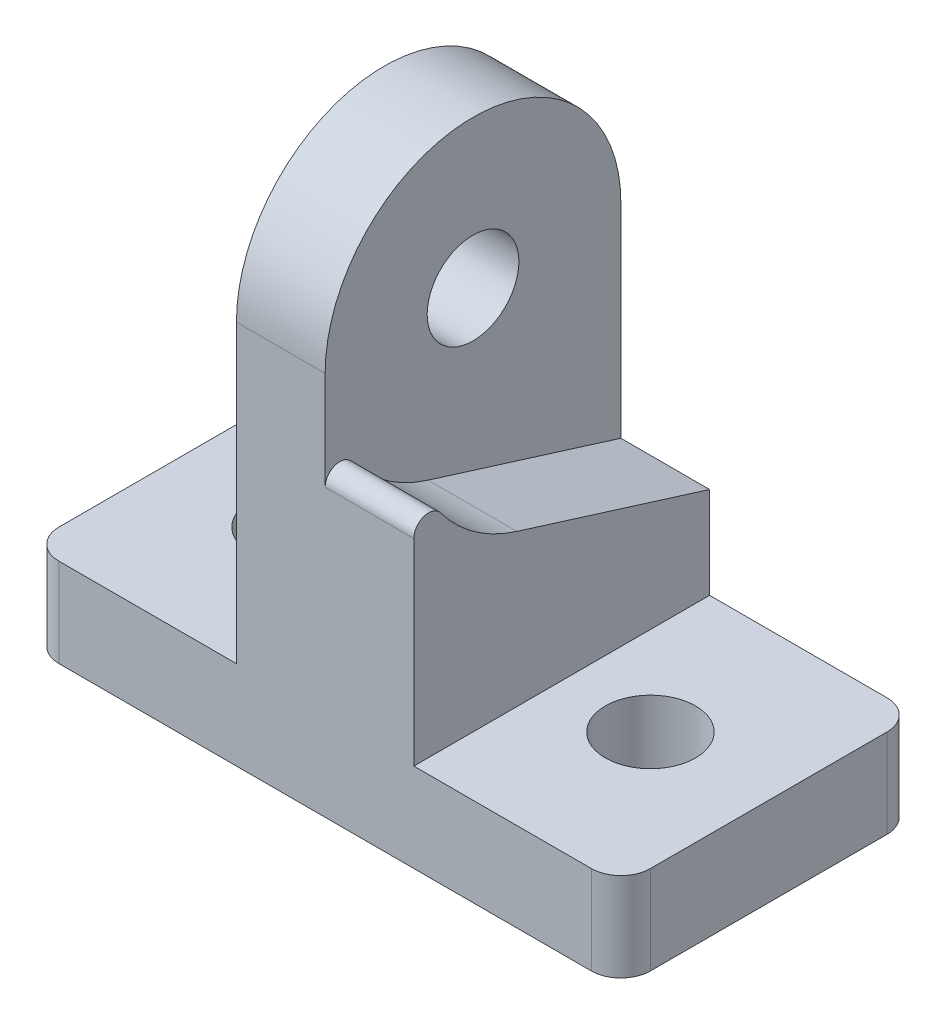
ISO-10303-21;
HEADER;
FILE_DESCRIPTION(('STEP AP214'),'2;1');
FILE_NAME('part.step','',(''),(''),'','','');
FILE_SCHEMA(('AUTOMOTIVE_DESIGN { 1 0 10303 214 1 1 1 1 }'));
ENDSEC;
DATA;
#1=APPLICATION_CONTEXT('core data for automotive mechanical design processes');
#2=APPLICATION_PROTOCOL_DEFINITION('international standard','automotive_design',2000,#1);
#3=PRODUCT_CONTEXT('',#1,'mechanical');
#4=PRODUCT('Part','Part','',(#3));
#5=PRODUCT_RELATED_PRODUCT_CATEGORY('part','',(#4));
#6=PRODUCT_DEFINITION_FORMATION('','',#4);
#7=PRODUCT_DEFINITION_CONTEXT('part definition',#1,'design');
#8=PRODUCT_DEFINITION('design','',#6,#7);
#9=PRODUCT_DEFINITION_SHAPE('','',#8);
#10=(LENGTH_UNIT() NAMED_UNIT(*) SI_UNIT(.MILLI.,.METRE.));
#11=(NAMED_UNIT(*) PLANE_ANGLE_UNIT() SI_UNIT($,.RADIAN.));
#12=(NAMED_UNIT(*) SI_UNIT($,.STERADIAN.) SOLID_ANGLE_UNIT());
#13=UNCERTAINTY_MEASURE_WITH_UNIT(LENGTH_MEASURE(1.E-05),#10,'distance_accuracy_value','');
#14=(GEOMETRIC_REPRESENTATION_CONTEXT(3) GLOBAL_UNCERTAINTY_ASSIGNED_CONTEXT((#13)) GLOBAL_UNIT_ASSIGNED_CONTEXT((#10,
#11,#12)) REPRESENTATION_CONTEXT('',''));
#15=CARTESIAN_POINT('',(0.,0.,0.));
#16=DIRECTION('',(0.,0.,1.));
#17=DIRECTION('',(1.,0.,0.));
#18=AXIS2_PLACEMENT_3D('',#15,#16,#17);
#19=CARTESIAN_POINT('',(0.,13.,0.));
#20=DIRECTION('',(-1.,0.,0.));
#21=DIRECTION('',(0.,0.,1.));
#22=AXIS2_PLACEMENT_3D('',#19,#20,#21);
#23=CYLINDRICAL_SURFACE('',#22,1.55);
#24=CARTESIAN_POINT('',(-3.,13.,0.));
#25=DIRECTION('',(-1.,0.,0.));
#26=DIRECTION('',(0.,0.,1.));
#27=AXIS2_PLACEMENT_3D('',#24,#25,#26);
#28=CIRCLE('',#27,1.55);
#29=CARTESIAN_POINT('',(-3.,13.,1.55));
#30=VERTEX_POINT('',#29);
#31=EDGE_CURVE('E173',#30,#30,#28,.T.);
#32=ORIENTED_EDGE('',*,*,#31,.T.);
#33=EDGE_LOOP('',(#32));
#34=FACE_BOUND('',#33,.T.);
#35=CARTESIAN_POINT('',(0.,13.,0.));
#36=DIRECTION('',(-1.,0.,0.));
#37=DIRECTION('',(0.,0.,1.));
#38=AXIS2_PLACEMENT_3D('',#35,#36,#37);
#39=CIRCLE('',#38,1.55);
#40=CARTESIAN_POINT('',(0.,13.,1.55));
#41=VERTEX_POINT('',#40);
#42=EDGE_CURVE('E176',#41,#41,#39,.T.);
#43=ORIENTED_EDGE('',*,*,#42,.F.);
#44=EDGE_LOOP('',(#43));
#45=FACE_BOUND('',#44,.T.);
#46=ADVANCED_FACE('F38',(#34,#45),#23,.F.);
#47=CARTESIAN_POINT('',(0.,3.,0.));
#48=DIRECTION('',(0.,-1.,0.));
#49=DIRECTION('',(0.,0.,-1.));
#50=AXIS2_PLACEMENT_3D('',#47,#48,#49);
#51=PLANE('',#50);
#52=CARTESIAN_POINT('',(6.,3.,0.));
#53=DIRECTION('',(0.,1.,0.));
#54=DIRECTION('',(0.,0.,1.));
#55=AXIS2_PLACEMENT_3D('',#52,#53,#54);
#56=CIRCLE('',#55,1.525);
#57=CARTESIAN_POINT('',(6.,3.,1.525));
#58=VERTEX_POINT('',#57);
#59=EDGE_CURVE('E213',#58,#58,#56,.T.);
#60=ORIENTED_EDGE('',*,*,#59,.F.);
#61=EDGE_LOOP('',(#60));
#62=FACE_BOUND('',#61,.T.);
#63=DIRECTION('',(0.,0.,-1.));
#64=VECTOR('',#63,1.);
#65=CARTESIAN_POINT('',(10.,3.,5.));
#66=LINE('',#65,#64);
#67=CARTESIAN_POINT('',(10.,3.,4.));
#68=VERTEX_POINT('',#67);
#69=CARTESIAN_POINT('',(10.,3.,-4.));
#70=VERTEX_POINT('',#69);
#71=EDGE_CURVE('E225',#68,#70,#66,.T.);
#72=ORIENTED_EDGE('',*,*,#71,.T.);
#73=CARTESIAN_POINT('',(9.,3.,-4.));
#74=DIRECTION('',(0.,-1.,0.));
#75=DIRECTION('',(0.,0.,-1.));
#76=AXIS2_PLACEMENT_3D('',#73,#74,#75);
#77=CIRCLE('',#76,1.);
#78=CARTESIAN_POINT('',(9.,3.,-5.));
#79=VERTEX_POINT('',#78);
#80=EDGE_CURVE('E278',#70,#79,#77,.F.);
#81=ORIENTED_EDGE('',*,*,#80,.T.);
#82=DIRECTION('',(-1.,0.,0.));
#83=VECTOR('',#82,1.);
#84=CARTESIAN_POINT('',(-10.,3.,-5.));
#85=LINE('',#84,#83);
#86=CARTESIAN_POINT('',(3.,3.,-5.));
#87=VERTEX_POINT('',#86);
#88=EDGE_CURVE('E230',#79,#87,#85,.T.);
#89=ORIENTED_EDGE('',*,*,#88,.T.);
#90=DIRECTION('',(0.,0.,-1.));
#91=VECTOR('',#90,1.);
#92=CARTESIAN_POINT('',(3.,3.,5.));
#93=LINE('',#92,#91);
#94=CARTESIAN_POINT('',(3.,3.,5.));
#95=VERTEX_POINT('',#94);
#96=EDGE_CURVE('E188',#95,#87,#93,.T.);
#97=ORIENTED_EDGE('',*,*,#96,.F.);
#98=DIRECTION('',(1.,0.,0.));
#99=VECTOR('',#98,1.);
#100=CARTESIAN_POINT('',(-10.,3.,5.));
#101=LINE('',#100,#99);
#102=CARTESIAN_POINT('',(9.,3.,5.));
#103=VERTEX_POINT('',#102);
#104=EDGE_CURVE('E236',#95,#103,#101,.T.);
#105=ORIENTED_EDGE('',*,*,#104,.T.);
#106=CARTESIAN_POINT('',(9.,3.,4.));
#107=DIRECTION('',(0.,-1.,0.));
#108=DIRECTION('',(0.,0.,-1.));
#109=AXIS2_PLACEMENT_3D('',#106,#107,#108);
#110=CIRCLE('',#109,1.);
#111=EDGE_CURVE('E276',#103,#68,#110,.F.);
#112=ORIENTED_EDGE('',*,*,#111,.T.);
#113=EDGE_LOOP('',(#72,#81,#89,#97,#105,#112));
#114=FACE_BOUND('',#113,.T.);
#115=ADVANCED_FACE('F347',(#62,#114),#51,.F.);
#116=CARTESIAN_POINT('',(-6.,3.,0.));
#117=DIRECTION('',(0.,1.,0.));
#118=DIRECTION('',(0.,0.,1.));
#119=AXIS2_PLACEMENT_3D('',#116,#117,#118);
#120=CIRCLE('',#119,1.525);
#121=CARTESIAN_POINT('',(-6.,3.,1.525));
#122=VERTEX_POINT('',#121);
#123=EDGE_CURVE('E219',#122,#122,#120,.T.);
#124=ORIENTED_EDGE('',*,*,#123,.F.);
#125=EDGE_LOOP('',(#124));
#126=FACE_BOUND('',#125,.T.);
#127=CARTESIAN_POINT('',(-3.,3.,-5.));
#128=VERTEX_POINT('',#127);
#129=CARTESIAN_POINT('',(-9.,3.,-5.));
#130=VERTEX_POINT('',#129);
#131=EDGE_CURVE('E228',#128,#130,#85,.T.);
#132=ORIENTED_EDGE('',*,*,#131,.T.);
#133=CARTESIAN_POINT('',(-9.,3.,-4.));
#134=DIRECTION('',(0.,-1.,0.));
#135=DIRECTION('',(0.,0.,-1.));
#136=AXIS2_PLACEMENT_3D('',#133,#134,#135);
#137=CIRCLE('',#136,1.);
#138=CARTESIAN_POINT('',(-10.,3.,-4.));
#139=VERTEX_POINT('',#138);
#140=EDGE_CURVE('E269',#130,#139,#137,.F.);
#141=ORIENTED_EDGE('',*,*,#140,.T.);
#142=DIRECTION('',(0.,0.,1.));
#143=VECTOR('',#142,1.);
#144=CARTESIAN_POINT('',(-10.,3.,5.));
#145=LINE('',#144,#143);
#146=CARTESIAN_POINT('',(-10.,3.,4.));
#147=VERTEX_POINT('',#146);
#148=EDGE_CURVE('E233',#139,#147,#145,.T.);
#149=ORIENTED_EDGE('',*,*,#148,.T.);
#150=CARTESIAN_POINT('',(-9.,3.,4.));
#151=DIRECTION('',(0.,-1.,0.));
#152=DIRECTION('',(0.,0.,-1.));
#153=AXIS2_PLACEMENT_3D('',#150,#151,#152);
#154=CIRCLE('',#153,1.);
#155=CARTESIAN_POINT('',(-9.,3.,5.));
#156=VERTEX_POINT('',#155);
#157=EDGE_CURVE('E267',#147,#156,#154,.F.);
#158=ORIENTED_EDGE('',*,*,#157,.T.);
#159=CARTESIAN_POINT('',(-3.,3.,5.));
#160=VERTEX_POINT('',#159);
#161=EDGE_CURVE('E237',#156,#160,#101,.T.);
#162=ORIENTED_EDGE('',*,*,#161,.T.);
#163=DIRECTION('',(0.,0.,1.));
#164=VECTOR('',#163,1.);
#165=CARTESIAN_POINT('',(-3.,3.,5.));
#166=LINE('',#165,#164);
#167=EDGE_CURVE('E195',#128,#160,#166,.T.);
#168=ORIENTED_EDGE('',*,*,#167,.F.);
#169=EDGE_LOOP('',(#132,#141,#149,#158,#162,#168));
#170=FACE_BOUND('',#169,.T.);
#171=ADVANCED_FACE('F349',(#126,#170),#51,.F.);
#172=CARTESIAN_POINT('',(0.,0.,0.));
#173=DIRECTION('',(0.,-1.,0.));
#174=DIRECTION('',(0.,0.,-1.));
#175=AXIS2_PLACEMENT_3D('',#172,#173,#174);
#176=PLANE('',#175);
#177=CARTESIAN_POINT('',(-6.,0.,0.));
#178=DIRECTION('',(0.,1.,0.));
#179=DIRECTION('',(0.,0.,1.));
#180=AXIS2_PLACEMENT_3D('',#177,#178,#179);
#181=CIRCLE('',#180,1.525);
#182=CARTESIAN_POINT('',(-6.,0.,1.525));
#183=VERTEX_POINT('',#182);
#184=EDGE_CURVE('E216',#183,#183,#181,.T.);
#185=ORIENTED_EDGE('',*,*,#184,.T.);
#186=EDGE_LOOP('',(#185));
#187=FACE_BOUND('',#186,.T.);
#188=DIRECTION('',(0.,0.,1.));
#189=VECTOR('',#188,1.);
#190=CARTESIAN_POINT('',(-10.,0.,5.));
#191=LINE('',#190,#189);
#192=CARTESIAN_POINT('',(-10.,0.,-4.));
#193=VERTEX_POINT('',#192);
#194=CARTESIAN_POINT('',(-10.,0.,4.));
#195=VERTEX_POINT('',#194);
#196=EDGE_CURVE('E245',#193,#195,#191,.T.);
#197=ORIENTED_EDGE('',*,*,#196,.F.);
#198=CARTESIAN_POINT('',(-9.,0.,-4.));
#199=DIRECTION('',(0.,-1.,0.));
#200=DIRECTION('',(0.,0.,-1.));
#201=AXIS2_PLACEMENT_3D('',#198,#199,#200);
#202=CIRCLE('',#201,1.);
#203=CARTESIAN_POINT('',(-9.,0.,-5.));
#204=VERTEX_POINT('',#203);
#205=EDGE_CURVE('E260',#193,#204,#202,.T.);
#206=ORIENTED_EDGE('',*,*,#205,.T.);
#207=DIRECTION('',(-1.,0.,0.));
#208=VECTOR('',#207,1.);
#209=CARTESIAN_POINT('',(-10.,0.,-5.));
#210=LINE('',#209,#208);
#211=CARTESIAN_POINT('',(9.,0.,-5.));
#212=VERTEX_POINT('',#211);
#213=EDGE_CURVE('E242',#212,#204,#210,.T.);
#214=ORIENTED_EDGE('',*,*,#213,.F.);
#215=CARTESIAN_POINT('',(9.,0.,-4.));
#216=DIRECTION('',(0.,-1.,0.));
#217=DIRECTION('',(0.,0.,-1.));
#218=AXIS2_PLACEMENT_3D('',#215,#216,#217);
#219=CIRCLE('',#218,1.);
#220=CARTESIAN_POINT('',(10.,0.,-4.));
#221=VERTEX_POINT('',#220);
#222=EDGE_CURVE('E258',#212,#221,#219,.T.);
#223=ORIENTED_EDGE('',*,*,#222,.T.);
#224=DIRECTION('',(0.,0.,-1.));
#225=VECTOR('',#224,1.);
#226=CARTESIAN_POINT('',(10.,0.,5.));
#227=LINE('',#226,#225);
#228=CARTESIAN_POINT('',(10.,0.,4.));
#229=VERTEX_POINT('',#228);
#230=EDGE_CURVE('E222',#229,#221,#227,.T.);
#231=ORIENTED_EDGE('',*,*,#230,.F.);
#232=CARTESIAN_POINT('',(9.,0.,4.));
#233=DIRECTION('',(0.,-1.,0.));
#234=DIRECTION('',(0.,0.,-1.));
#235=AXIS2_PLACEMENT_3D('',#232,#233,#234);
#236=CIRCLE('',#235,1.);
#237=CARTESIAN_POINT('',(9.,0.,5.));
#238=VERTEX_POINT('',#237);
#239=EDGE_CURVE('E256',#229,#238,#236,.T.);
#240=ORIENTED_EDGE('',*,*,#239,.T.);
#241=DIRECTION('',(1.,0.,0.));
#242=VECTOR('',#241,1.);
#243=CARTESIAN_POINT('',(-10.,0.,5.));
#244=LINE('',#243,#242);
#245=CARTESIAN_POINT('',(-9.,0.,5.));
#246=VERTEX_POINT('',#245);
#247=EDGE_CURVE('E229',#246,#238,#244,.T.);
#248=ORIENTED_EDGE('',*,*,#247,.F.);
#249=CARTESIAN_POINT('',(-9.,0.,4.));
#250=DIRECTION('',(0.,-1.,0.));
#251=DIRECTION('',(0.,0.,-1.));
#252=AXIS2_PLACEMENT_3D('',#249,#250,#251);
#253=CIRCLE('',#252,1.);
#254=EDGE_CURVE('E254',#246,#195,#253,.T.);
#255=ORIENTED_EDGE('',*,*,#254,.T.);
#256=EDGE_LOOP('',(#197,#206,#214,#223,#231,#240,#248,#255));
#257=FACE_BOUND('',#256,.T.);
#258=CARTESIAN_POINT('',(6.,0.,0.));
#259=DIRECTION('',(0.,1.,0.));
#260=DIRECTION('',(0.,0.,1.));
#261=AXIS2_PLACEMENT_3D('',#258,#259,#260);
#262=CIRCLE('',#261,1.525);
#263=CARTESIAN_POINT('',(6.,0.,1.525));
#264=VERTEX_POINT('',#263);
#265=EDGE_CURVE('E212',#264,#264,#262,.T.);
#266=ORIENTED_EDGE('',*,*,#265,.T.);
#267=EDGE_LOOP('',(#266));
#268=FACE_BOUND('',#267,.T.);
#269=ADVANCED_FACE('F317',(#187,#257,#268),#176,.T.);
#270=CARTESIAN_POINT('',(10.,3.,5.));
#271=DIRECTION('',(-1.,0.,0.));
#272=DIRECTION('',(0.,0.,1.));
#273=AXIS2_PLACEMENT_3D('',#270,#271,#272);
#274=PLANE('',#273);
#275=ORIENTED_EDGE('',*,*,#230,.T.);
#276=DIRECTION('',(0.,-1.,0.));
#277=VECTOR('',#276,1.);
#278=CARTESIAN_POINT('',(10.,3.,-4.));
#279=LINE('',#278,#277);
#280=EDGE_CURVE('E274',#221,#70,#279,.F.);
#281=ORIENTED_EDGE('',*,*,#280,.T.);
#282=ORIENTED_EDGE('',*,*,#71,.F.);
#283=DIRECTION('',(0.,-1.,0.));
#284=VECTOR('',#283,1.);
#285=CARTESIAN_POINT('',(10.,3.,4.));
#286=LINE('',#285,#284);
#287=EDGE_CURVE('E271',#68,#229,#286,.T.);
#288=ORIENTED_EDGE('',*,*,#287,.T.);
#289=EDGE_LOOP('',(#275,#281,#282,#288));
#290=FACE_BOUND('',#289,.T.);
#291=ADVANCED_FACE('F337',(#290),#274,.F.);
#292=CARTESIAN_POINT('',(-10.,3.,-5.));
#293=DIRECTION('',(0.,0.,1.));
#294=DIRECTION('',(1.,0.,0.));
#295=AXIS2_PLACEMENT_3D('',#292,#293,#294);
#296=PLANE('',#295);
#297=DIRECTION('',(0.,1.,0.));
#298=VECTOR('',#297,1.);
#299=CARTESIAN_POINT('',(0.,14.0990626918164,-5.));
#300=LINE('',#299,#298);
#301=CARTESIAN_POINT('',(0.,6.1,-5.));
#302=VERTEX_POINT('',#301);
#303=CARTESIAN_POINT('',(0.,13.,-5.));
#304=VERTEX_POINT('',#303);
#305=EDGE_CURVE('E178',#302,#304,#300,.T.);
#306=ORIENTED_EDGE('',*,*,#305,.F.);
#307=DIRECTION('',(1.,0.,0.));
#308=VECTOR('',#307,1.);
#309=CARTESIAN_POINT('',(0.,6.1,-5.));
#310=LINE('',#309,#308);
#311=CARTESIAN_POINT('',(3.,6.1,-5.));
#312=VERTEX_POINT('',#311);
#313=EDGE_CURVE('E156',#302,#312,#310,.T.);
#314=ORIENTED_EDGE('',*,*,#313,.T.);
#315=DIRECTION('',(0.,-1.,0.));
#316=VECTOR('',#315,1.);
#317=CARTESIAN_POINT('',(3.,13.,-5.));
#318=LINE('',#317,#316);
#319=EDGE_CURVE('E210',#312,#87,#318,.T.);
#320=ORIENTED_EDGE('',*,*,#319,.T.);
#321=ORIENTED_EDGE('',*,*,#88,.F.);
#322=DIRECTION('',(0.,-1.,0.));
#323=VECTOR('',#322,1.);
#324=CARTESIAN_POINT('',(9.,3.,-5.));
#325=LINE('',#324,#323);
#326=EDGE_CURVE('E262',#79,#212,#325,.T.);
#327=ORIENTED_EDGE('',*,*,#326,.T.);
#328=ORIENTED_EDGE('',*,*,#213,.T.);
#329=DIRECTION('',(0.,-1.,0.));
#330=VECTOR('',#329,1.);
#331=CARTESIAN_POINT('',(-9.,3.,-5.));
#332=LINE('',#331,#330);
#333=EDGE_CURVE('E265',#204,#130,#332,.F.);
#334=ORIENTED_EDGE('',*,*,#333,.T.);
#335=ORIENTED_EDGE('',*,*,#131,.F.);
#336=DIRECTION('',(0.,-1.,0.));
#337=VECTOR('',#336,1.);
#338=CARTESIAN_POINT('',(-3.,13.,-5.));
#339=LINE('',#338,#337);
#340=CARTESIAN_POINT('',(-3.,13.,-5.));
#341=VERTEX_POINT('',#340);
#342=EDGE_CURVE('E207',#341,#128,#339,.T.);
#343=ORIENTED_EDGE('',*,*,#342,.F.);
#344=DIRECTION('',(-1.,0.,0.));
#345=VECTOR('',#344,1.);
#346=CARTESIAN_POINT('',(-3.,13.,-5.));
#347=LINE('',#346,#345);
#348=EDGE_CURVE('E191',#304,#341,#347,.T.);
#349=ORIENTED_EDGE('',*,*,#348,.F.);
#350=EDGE_LOOP('',(#306,#314,#320,#321,#327,#328,#334,#335,#343,#349));
#351=FACE_BOUND('',#350,.T.);
#352=ADVANCED_FACE('F299',(#351),#296,.F.);
#353=CARTESIAN_POINT('',(-10.,3.,5.));
#354=DIRECTION('',(1.,0.,0.));
#355=DIRECTION('',(0.,0.,-1.));
#356=AXIS2_PLACEMENT_3D('',#353,#354,#355);
#357=PLANE('',#356);
#358=ORIENTED_EDGE('',*,*,#148,.F.);
#359=DIRECTION('',(0.,-1.,0.));
#360=VECTOR('',#359,1.);
#361=CARTESIAN_POINT('',(-10.,3.,-4.));
#362=LINE('',#361,#360);
#363=EDGE_CURVE('E251',#139,#193,#362,.T.);
#364=ORIENTED_EDGE('',*,*,#363,.T.);
#365=ORIENTED_EDGE('',*,*,#196,.T.);
#366=DIRECTION('',(0.,-1.,0.));
#367=VECTOR('',#366,1.);
#368=CARTESIAN_POINT('',(-10.,3.,4.));
#369=LINE('',#368,#367);
#370=EDGE_CURVE('E239',#195,#147,#369,.F.);
#371=ORIENTED_EDGE('',*,*,#370,.T.);
#372=EDGE_LOOP('',(#358,#364,#365,#371));
#373=FACE_BOUND('',#372,.T.);
#374=ADVANCED_FACE('F321',(#373),#357,.F.);
#375=CARTESIAN_POINT('',(-10.,3.,5.));
#376=DIRECTION('',(0.,0.,-1.));
#377=DIRECTION('',(-1.,0.,0.));
#378=AXIS2_PLACEMENT_3D('',#375,#376,#377);
#379=PLANE('',#378);
#380=DIRECTION('',(0.,-1.,0.));
#381=VECTOR('',#380,1.);
#382=CARTESIAN_POINT('',(3.,13.,5.));
#383=LINE('',#382,#381);
#384=CARTESIAN_POINT('',(3.,9.66683333750021,5.));
#385=VERTEX_POINT('',#384);
#386=EDGE_CURVE('E198',#385,#95,#383,.T.);
#387=ORIENTED_EDGE('',*,*,#386,.F.);
#388=DIRECTION('',(1.,0.,0.));
#389=VECTOR('',#388,1.);
#390=CARTESIAN_POINT('',(-10.,9.66683333750021,5.));
#391=LINE('',#390,#389);
#392=CARTESIAN_POINT('',(0.,9.66683333750021,5.));
#393=VERTEX_POINT('',#392);
#394=EDGE_CURVE('E46',#385,#393,#391,.F.);
#395=ORIENTED_EDGE('',*,*,#394,.T.);
#396=DIRECTION('',(0.,-1.,0.));
#397=VECTOR('',#396,1.);
#398=CARTESIAN_POINT('',(0.,11.9950124378879,5.));
#399=LINE('',#398,#397);
#400=CARTESIAN_POINT('',(0.,13.,5.));
#401=VERTEX_POINT('',#400);
#402=EDGE_CURVE('E52',#401,#393,#399,.T.);
#403=ORIENTED_EDGE('',*,*,#402,.F.);
#404=DIRECTION('',(1.,0.,0.));
#405=VECTOR('',#404,1.);
#406=CARTESIAN_POINT('',(-3.,13.,5.));
#407=LINE('',#406,#405);
#408=CARTESIAN_POINT('',(-3.,13.,5.));
#409=VERTEX_POINT('',#408);
#410=EDGE_CURVE('E194',#409,#401,#407,.T.);
#411=ORIENTED_EDGE('',*,*,#410,.F.);
#412=DIRECTION('',(0.,-1.,0.));
#413=VECTOR('',#412,1.);
#414=CARTESIAN_POINT('',(-3.,13.,5.));
#415=LINE('',#414,#413);
#416=EDGE_CURVE('E204',#409,#160,#415,.T.);
#417=ORIENTED_EDGE('',*,*,#416,.T.);
#418=ORIENTED_EDGE('',*,*,#161,.F.);
#419=DIRECTION('',(0.,-1.,0.));
#420=VECTOR('',#419,1.);
#421=CARTESIAN_POINT('',(-9.,3.,5.));
#422=LINE('',#421,#420);
#423=EDGE_CURVE('E280',#156,#246,#422,.T.);
#424=ORIENTED_EDGE('',*,*,#423,.T.);
#425=ORIENTED_EDGE('',*,*,#247,.T.);
#426=DIRECTION('',(0.,-1.,0.));
#427=VECTOR('',#426,1.);
#428=CARTESIAN_POINT('',(9.,3.,5.));
#429=LINE('',#428,#427);
#430=EDGE_CURVE('E283',#238,#103,#429,.F.);
#431=ORIENTED_EDGE('',*,*,#430,.T.);
#432=ORIENTED_EDGE('',*,*,#104,.F.);
#433=EDGE_LOOP('',(#387,#395,#403,#411,#417,#418,#424,#425,#431,#432));
#434=FACE_BOUND('',#433,.T.);
#435=ADVANCED_FACE('F289',(#434),#379,.F.);
#436=CARTESIAN_POINT('',(-6.,3.,0.));
#437=DIRECTION('',(0.,-1.,0.));
#438=DIRECTION('',(0.,0.,-1.));
#439=AXIS2_PLACEMENT_3D('',#436,#437,#438);
#440=CYLINDRICAL_SURFACE('',#439,1.525);
#441=ORIENTED_EDGE('',*,*,#123,.T.);
#442=EDGE_LOOP('',(#441));
#443=FACE_BOUND('',#442,.T.);
#444=ORIENTED_EDGE('',*,*,#184,.F.);
#445=EDGE_LOOP('',(#444));
#446=FACE_BOUND('',#445,.T.);
#447=ADVANCED_FACE('F362',(#443,#446),#440,.F.);
#448=CARTESIAN_POINT('',(6.,3.,0.));
#449=DIRECTION('',(0.,-1.,0.));
#450=DIRECTION('',(0.,0.,-1.));
#451=AXIS2_PLACEMENT_3D('',#448,#449,#450);
#452=CYLINDRICAL_SURFACE('',#451,1.525);
#453=ORIENTED_EDGE('',*,*,#59,.T.);
#454=EDGE_LOOP('',(#453));
#455=FACE_BOUND('',#454,.T.);
#456=ORIENTED_EDGE('',*,*,#265,.F.);
#457=EDGE_LOOP('',(#456));
#458=FACE_BOUND('',#457,.T.);
#459=ADVANCED_FACE('F397',(#455,#458),#452,.F.);
#460=CARTESIAN_POINT('',(3.,13.,5.));
#461=DIRECTION('',(-1.,0.,0.));
#462=DIRECTION('',(0.,0.,1.));
#463=AXIS2_PLACEMENT_3D('',#460,#461,#462);
#464=PLANE('',#463);
#465=ORIENTED_EDGE('',*,*,#319,.F.);
#466=DIRECTION('',(0.,-0.297511264809501,-0.954718307832971));
#467=VECTOR('',#466,1.);
#468=CARTESIAN_POINT('',(3.,8.13093663005185,1.51730745052845));
#469=LINE('',#468,#467);
#470=CARTESIAN_POINT('',(3.,8.13093663005185,1.51730745052845));
#471=VERTEX_POINT('',#470);
#472=EDGE_CURVE('E159',#471,#312,#469,.T.);
#473=ORIENTED_EDGE('',*,*,#472,.F.);
#474=CARTESIAN_POINT('',(3.,13.,0.));
#475=DIRECTION('',(1.,0.,0.));
#476=DIRECTION('',(0.,0.,-1.));
#477=AXIS2_PLACEMENT_3D('',#474,#475,#476);
#478=CIRCLE('',#477,5.1);
#479=CARTESIAN_POINT('',(3.,9.96443750379484,4.09821428571429));
#480=VERTEX_POINT('',#479);
#481=EDGE_CURVE('E168',#480,#471,#478,.T.);
#482=ORIENTED_EDGE('',*,*,#481,.F.);
#483=CARTESIAN_POINT('',(3.,9.66683333750021,4.5));
#484=DIRECTION('',(-1.,0.,0.));
#485=DIRECTION('',(0.,0.,1.));
#486=AXIS2_PLACEMENT_3D('',#483,#484,#485);
#487=CIRCLE('',#486,0.5);
#488=EDGE_CURVE('E60',#480,#385,#487,.F.);
#489=ORIENTED_EDGE('',*,*,#488,.T.);
#490=ORIENTED_EDGE('',*,*,#386,.T.);
#491=ORIENTED_EDGE('',*,*,#96,.T.);
#492=EDGE_LOOP('',(#465,#473,#482,#489,#490,#491));
#493=FACE_BOUND('',#492,.T.);
#494=ADVANCED_FACE('F294',(#493),#464,.F.);
#495=CARTESIAN_POINT('',(-3.,13.,5.));
#496=DIRECTION('',(1.,0.,0.));
#497=DIRECTION('',(0.,0.,-1.));
#498=AXIS2_PLACEMENT_3D('',#495,#496,#497);
#499=PLANE('',#498);
#500=ORIENTED_EDGE('',*,*,#416,.F.);
#501=CARTESIAN_POINT('',(-3.,13.,0.));
#502=DIRECTION('',(-1.,0.,0.));
#503=DIRECTION('',(0.,0.,1.));
#504=AXIS2_PLACEMENT_3D('',#501,#502,#503);
#505=CIRCLE('',#504,5.);
#506=EDGE_CURVE('E184',#409,#341,#505,.T.);
#507=ORIENTED_EDGE('',*,*,#506,.T.);
#508=ORIENTED_EDGE('',*,*,#342,.T.);
#509=ORIENTED_EDGE('',*,*,#167,.T.);
#510=EDGE_LOOP('',(#500,#507,#508,#509));
#511=FACE_BOUND('',#510,.T.);
#512=ORIENTED_EDGE('',*,*,#31,.F.);
#513=EDGE_LOOP('',(#512));
#514=FACE_BOUND('',#513,.T.);
#515=ADVANCED_FACE('F305',(#511,#514),#499,.F.);
#516=CARTESIAN_POINT('',(0.,13.,0.));
#517=DIRECTION('',(-1.,0.,0.));
#518=DIRECTION('',(0.,0.,1.));
#519=AXIS2_PLACEMENT_3D('',#516,#517,#518);
#520=CYLINDRICAL_SURFACE('',#519,5.);
#521=ORIENTED_EDGE('',*,*,#410,.T.);
#522=CARTESIAN_POINT('',(0.,13.,0.));
#523=DIRECTION('',(-1.,0.,0.));
#524=DIRECTION('',(0.,0.,1.));
#525=AXIS2_PLACEMENT_3D('',#522,#523,#524);
#526=CIRCLE('',#525,5.);
#527=EDGE_CURVE('E186',#401,#304,#526,.T.);
#528=ORIENTED_EDGE('',*,*,#527,.T.);
#529=ORIENTED_EDGE('',*,*,#348,.T.);
#530=ORIENTED_EDGE('',*,*,#506,.F.);
#531=EDGE_LOOP('',(#521,#528,#529,#530));
#532=FACE_BOUND('',#531,.T.);
#533=ADVANCED_FACE('F303',(#532),#520,.T.);
#534=CARTESIAN_POINT('',(0.,13.,0.));
#535=DIRECTION('',(-1.,0.,0.));
#536=DIRECTION('',(0.,0.,1.));
#537=AXIS2_PLACEMENT_3D('',#534,#535,#536);
#538=PLANE('',#537);
#539=DIRECTION('',(0.,-0.297511264809501,-0.954718307832971));
#540=VECTOR('',#539,1.);
#541=CARTESIAN_POINT('',(0.,8.13093663005185,1.51730745052845));
#542=LINE('',#541,#540);
#543=CARTESIAN_POINT('',(0.,8.13093663005185,1.51730745052845));
#544=VERTEX_POINT('',#543);
#545=EDGE_CURVE('E150',#544,#302,#542,.T.);
#546=ORIENTED_EDGE('',*,*,#545,.T.);
#547=ORIENTED_EDGE('',*,*,#305,.T.);
#548=ORIENTED_EDGE('',*,*,#527,.F.);
#549=ORIENTED_EDGE('',*,*,#402,.T.);
#550=CARTESIAN_POINT('',(0.,9.66683333750021,4.5));
#551=DIRECTION('',(-1.,0.,0.));
#552=DIRECTION('',(0.,0.,1.));
#553=AXIS2_PLACEMENT_3D('',#550,#551,#552);
#554=CIRCLE('',#553,0.5);
#555=CARTESIAN_POINT('',(0.,9.96443750379484,4.09821428571429));
#556=VERTEX_POINT('',#555);
#557=EDGE_CURVE('E11',#393,#556,#554,.T.);
#558=ORIENTED_EDGE('',*,*,#557,.T.);
#559=CARTESIAN_POINT('',(0.,13.,0.));
#560=DIRECTION('',(1.,0.,0.));
#561=DIRECTION('',(0.,0.,-1.));
#562=AXIS2_PLACEMENT_3D('',#559,#560,#561);
#563=CIRCLE('',#562,5.1);
#564=EDGE_CURVE('E166',#556,#544,#563,.T.);
#565=ORIENTED_EDGE('',*,*,#564,.T.);
#566=EDGE_LOOP('',(#546,#547,#548,#549,#558,#565));
#567=FACE_BOUND('',#566,.T.);
#568=ORIENTED_EDGE('',*,*,#42,.T.);
#569=EDGE_LOOP('',(#568));
#570=FACE_BOUND('',#569,.T.);
#571=ADVANCED_FACE('F170',(#567,#570),#538,.F.);
#572=CARTESIAN_POINT('',(-9.,3.,-4.));
#573=DIRECTION('',(0.,-1.,0.));
#574=DIRECTION('',(0.,0.,-1.));
#575=AXIS2_PLACEMENT_3D('',#572,#573,#574);
#576=CYLINDRICAL_SURFACE('',#575,1.);
#577=ORIENTED_EDGE('',*,*,#140,.F.);
#578=ORIENTED_EDGE('',*,*,#333,.F.);
#579=ORIENTED_EDGE('',*,*,#205,.F.);
#580=ORIENTED_EDGE('',*,*,#363,.F.);
#581=EDGE_LOOP('',(#577,#578,#579,#580));
#582=FACE_BOUND('',#581,.T.);
#583=ADVANCED_FACE('F325',(#582),#576,.T.);
#584=CARTESIAN_POINT('',(9.,3.,-4.));
#585=DIRECTION('',(0.,-1.,0.));
#586=DIRECTION('',(0.,0.,-1.));
#587=AXIS2_PLACEMENT_3D('',#584,#585,#586);
#588=CYLINDRICAL_SURFACE('',#587,1.);
#589=ORIENTED_EDGE('',*,*,#80,.F.);
#590=ORIENTED_EDGE('',*,*,#280,.F.);
#591=ORIENTED_EDGE('',*,*,#222,.F.);
#592=ORIENTED_EDGE('',*,*,#326,.F.);
#593=EDGE_LOOP('',(#589,#590,#591,#592));
#594=FACE_BOUND('',#593,.T.);
#595=ADVANCED_FACE('F333',(#594),#588,.T.);
#596=CARTESIAN_POINT('',(9.,3.,4.));
#597=DIRECTION('',(0.,-1.,0.));
#598=DIRECTION('',(0.,0.,-1.));
#599=AXIS2_PLACEMENT_3D('',#596,#597,#598);
#600=CYLINDRICAL_SURFACE('',#599,1.);
#601=ORIENTED_EDGE('',*,*,#111,.F.);
#602=ORIENTED_EDGE('',*,*,#430,.F.);
#603=ORIENTED_EDGE('',*,*,#239,.F.);
#604=ORIENTED_EDGE('',*,*,#287,.F.);
#605=EDGE_LOOP('',(#601,#602,#603,#604));
#606=FACE_BOUND('',#605,.T.);
#607=ADVANCED_FACE('F342',(#606),#600,.T.);
#608=CARTESIAN_POINT('',(-9.,3.,4.));
#609=DIRECTION('',(0.,-1.,0.));
#610=DIRECTION('',(0.,0.,-1.));
#611=AXIS2_PLACEMENT_3D('',#608,#609,#610);
#612=CYLINDRICAL_SURFACE('',#611,1.);
#613=ORIENTED_EDGE('',*,*,#157,.F.);
#614=ORIENTED_EDGE('',*,*,#370,.F.);
#615=ORIENTED_EDGE('',*,*,#254,.F.);
#616=ORIENTED_EDGE('',*,*,#423,.F.);
#617=EDGE_LOOP('',(#613,#614,#615,#616));
#618=FACE_BOUND('',#617,.T.);
#619=ADVANCED_FACE('F313',(#618),#612,.T.);
#620=CARTESIAN_POINT('',(0.,13.,0.));
#621=DIRECTION('',(1.,0.,0.));
#622=DIRECTION('',(0.,0.,-1.));
#623=AXIS2_PLACEMENT_3D('',#620,#621,#622);
#624=CYLINDRICAL_SURFACE('',#623,5.1);
#625=ORIENTED_EDGE('',*,*,#481,.T.);
#626=DIRECTION('',(1.,0.,0.));
#627=VECTOR('',#626,1.);
#628=CARTESIAN_POINT('',(0.,8.13093663005185,1.51730745052845));
#629=LINE('',#628,#627);
#630=EDGE_CURVE('E153',#544,#471,#629,.T.);
#631=ORIENTED_EDGE('',*,*,#630,.F.);
#632=ORIENTED_EDGE('',*,*,#564,.F.);
#633=DIRECTION('',(1.,0.,0.));
#634=VECTOR('',#633,1.);
#635=CARTESIAN_POINT('',(0.,9.96443750379484,4.09821428571429));
#636=LINE('',#635,#634);
#637=EDGE_CURVE('E285',#556,#480,#636,.T.);
#638=ORIENTED_EDGE('',*,*,#637,.T.);
#639=EDGE_LOOP('',(#625,#631,#632,#638));
#640=FACE_BOUND('',#639,.T.);
#641=ADVANCED_FACE('F164',(#640),#624,.F.);
#642=CARTESIAN_POINT('',(0.,9.66683333750021,4.5));
#643=DIRECTION('',(1.,0.,0.));
#644=DIRECTION('',(0.,0.,-1.));
#645=AXIS2_PLACEMENT_3D('',#642,#643,#644);
#646=CYLINDRICAL_SURFACE('',#645,0.5);
#647=ORIENTED_EDGE('',*,*,#557,.F.);
#648=ORIENTED_EDGE('',*,*,#394,.F.);
#649=ORIENTED_EDGE('',*,*,#488,.F.);
#650=ORIENTED_EDGE('',*,*,#637,.F.);
#651=EDGE_LOOP('',(#647,#648,#649,#650));
#652=FACE_BOUND('',#651,.T.);
#653=ADVANCED_FACE('F40',(#652),#646,.T.);
#654=CARTESIAN_POINT('',(0.,8.13093663005185,1.51730745052845));
#655=DIRECTION('',(0.,-0.954718307832971,0.297511264809501));
#656=DIRECTION('',(0.,-0.297511264809501,-0.954718307832971));
#657=AXIS2_PLACEMENT_3D('',#654,#655,#656);
#658=PLANE('',#657);
#659=ORIENTED_EDGE('',*,*,#472,.T.);
#660=ORIENTED_EDGE('',*,*,#313,.F.);
#661=ORIENTED_EDGE('',*,*,#545,.F.);
#662=ORIENTED_EDGE('',*,*,#630,.T.);
#663=EDGE_LOOP('',(#659,#660,#661,#662));
#664=FACE_BOUND('',#663,.T.);
#665=ADVANCED_FACE('F152',(#664),#658,.F.);
#666=CLOSED_SHELL('',(#46,#115,#171,#269,#291,#352,#374,#435,#447,#459,#494,#515,#533,#571,#583,
#595,#607,#619,#641,#653,#665));
#667=MANIFOLD_SOLID_BREP('B2',#666);
#668=ADVANCED_BREP_SHAPE_REPRESENTATION('',(#18,#667),#14);
#669=SHAPE_DEFINITION_REPRESENTATION(#9,#668);
ENDSEC;
END-ISO-10303-21;
